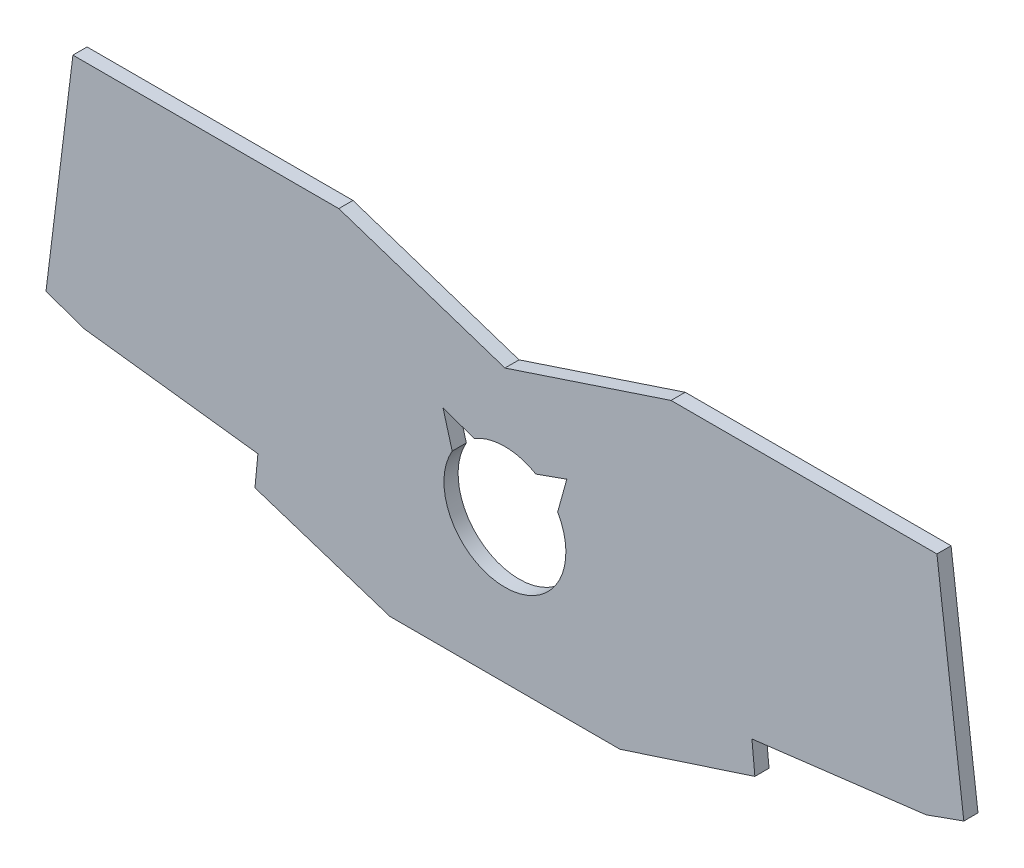
ISO-10303-21;
HEADER;
FILE_DESCRIPTION(('STEP AP214'),'2;1');
FILE_NAME('part.step','',(''),(''),'','','');
FILE_SCHEMA(('AUTOMOTIVE_DESIGN { 1 0 10303 214 1 1 1 1 }'));
ENDSEC;
DATA;
#1=APPLICATION_CONTEXT('core data for automotive mechanical design processes');
#2=APPLICATION_PROTOCOL_DEFINITION('international standard','automotive_design',2000,#1);
#3=PRODUCT_CONTEXT('',#1,'mechanical');
#4=PRODUCT('Part','Part','',(#3));
#5=PRODUCT_RELATED_PRODUCT_CATEGORY('part','',(#4));
#6=PRODUCT_DEFINITION_FORMATION('','',#4);
#7=PRODUCT_DEFINITION_CONTEXT('part definition',#1,'design');
#8=PRODUCT_DEFINITION('design','',#6,#7);
#9=PRODUCT_DEFINITION_SHAPE('','',#8);
#10=(LENGTH_UNIT() NAMED_UNIT(*) SI_UNIT(.MILLI.,.METRE.));
#11=(NAMED_UNIT(*) PLANE_ANGLE_UNIT() SI_UNIT($,.RADIAN.));
#12=(NAMED_UNIT(*) SI_UNIT($,.STERADIAN.) SOLID_ANGLE_UNIT());
#13=UNCERTAINTY_MEASURE_WITH_UNIT(LENGTH_MEASURE(1.E-05),#10,'distance_accuracy_value','');
#14=(GEOMETRIC_REPRESENTATION_CONTEXT(3) GLOBAL_UNCERTAINTY_ASSIGNED_CONTEXT((#13)) GLOBAL_UNIT_ASSIGNED_CONTEXT((#10,
#11,#12)) REPRESENTATION_CONTEXT('',''));
#15=CARTESIAN_POINT('',(0.,0.,0.));
#16=DIRECTION('',(0.,0.,1.));
#17=DIRECTION('',(1.,0.,0.));
#18=AXIS2_PLACEMENT_3D('',#15,#16,#17);
#19=CARTESIAN_POINT('',(24.215888920646,-67.992523684936,5.));
#20=DIRECTION('',(-0.33551108493973,0.942036258263218,0.));
#21=DIRECTION('',(-0.942036258263219,-0.33551108493973,0.));
#22=AXIS2_PLACEMENT_3D('',#19,#20,#21);
#23=PLANE('',#22);
#24=DIRECTION('',(0.942036258263219,0.33551108493973,0.));
#25=VECTOR('',#24,1.);
#26=CARTESIAN_POINT('',(24.215888920646,-67.992523684936,0.));
#27=LINE('',#26,#25);
#28=CARTESIAN_POINT('',(148.658722082,-23.6715651223478,0.));
#29=VERTEX_POINT('',#28);
#30=CARTESIAN_POINT('',(162.,-18.92,0.));
#31=VERTEX_POINT('',#30);
#32=EDGE_CURVE('E228',#29,#31,#27,.T.);
#33=ORIENTED_EDGE('',*,*,#32,.T.);
#34=DIRECTION('',(0.,0.,-1.));
#35=VECTOR('',#34,1.);
#36=CARTESIAN_POINT('',(162.,-18.92,5.));
#37=LINE('',#36,#35);
#38=CARTESIAN_POINT('',(162.,-18.92,5.));
#39=VERTEX_POINT('',#38);
#40=EDGE_CURVE('E11',#39,#31,#37,.T.);
#41=ORIENTED_EDGE('',*,*,#40,.F.);
#42=DIRECTION('',(0.942036258263219,0.33551108493973,0.));
#43=VECTOR('',#42,1.);
#44=CARTESIAN_POINT('',(24.215888920646,-67.992523684936,5.));
#45=LINE('',#44,#43);
#46=CARTESIAN_POINT('',(148.658722082,-23.6715651223478,5.));
#47=VERTEX_POINT('',#46);
#48=EDGE_CURVE('E577',#47,#39,#45,.T.);
#49=ORIENTED_EDGE('',*,*,#48,.F.);
#50=DIRECTION('',(0.,0.,-1.));
#51=VECTOR('',#50,1.);
#52=CARTESIAN_POINT('',(148.658722082,-23.6715651223478,5.));
#53=LINE('',#52,#51);
#54=EDGE_CURVE('E257',#47,#29,#53,.T.);
#55=ORIENTED_EDGE('',*,*,#54,.T.);
#56=EDGE_LOOP('',(#33,#41,#49,#55));
#57=FACE_BOUND('',#56,.T.);
#58=ADVANCED_FACE('F35',(#57),#23,.F.);
#59=CARTESIAN_POINT('',(157.264457802483,19.4229374561049,5.));
#60=DIRECTION('',(-0.992459421045995,-0.122573641444838,0.));
#61=DIRECTION('',(0.122573641444838,-0.992459421045995,0.));
#62=AXIS2_PLACEMENT_3D('',#59,#60,#61);
#63=PLANE('',#62);
#64=DIRECTION('',(-0.122573641444838,0.992459421045995,0.));
#65=VECTOR('',#64,1.);
#66=CARTESIAN_POINT('',(157.264457802483,19.4229374561049,0.));
#67=LINE('',#66,#65);
#68=CARTESIAN_POINT('',(152.5,58.,0.));
#69=VERTEX_POINT('',#68);
#70=EDGE_CURVE('E231',#31,#69,#67,.T.);
#71=ORIENTED_EDGE('',*,*,#70,.T.);
#72=DIRECTION('',(0.,0.,-1.));
#73=VECTOR('',#72,1.);
#74=CARTESIAN_POINT('',(152.5,58.,5.));
#75=LINE('',#74,#73);
#76=CARTESIAN_POINT('',(152.5,58.,5.));
#77=VERTEX_POINT('',#76);
#78=EDGE_CURVE('E45',#77,#69,#75,.T.);
#79=ORIENTED_EDGE('',*,*,#78,.F.);
#80=DIRECTION('',(-0.122573641444838,0.992459421045995,0.));
#81=VECTOR('',#80,1.);
#82=CARTESIAN_POINT('',(157.264457802483,19.4229374561049,5.));
#83=LINE('',#82,#81);
#84=EDGE_CURVE('E578',#39,#77,#83,.T.);
#85=ORIENTED_EDGE('',*,*,#84,.F.);
#86=ORIENTED_EDGE('',*,*,#40,.T.);
#87=EDGE_LOOP('',(#71,#79,#85,#86));
#88=FACE_BOUND('',#87,.T.);
#89=ADVANCED_FACE('F338',(#88),#63,.F.);
#90=CARTESIAN_POINT('',(0.,58.,5.));
#91=DIRECTION('',(0.,-1.,0.));
#92=DIRECTION('',(0.,0.,-1.));
#93=AXIS2_PLACEMENT_3D('',#90,#91,#92);
#94=PLANE('',#93);
#95=DIRECTION('',(-1.,0.,0.));
#96=VECTOR('',#95,1.);
#97=CARTESIAN_POINT('',(0.,58.,0.));
#98=LINE('',#97,#96);
#99=CARTESIAN_POINT('',(58.64,58.,0.));
#100=VERTEX_POINT('',#99);
#101=EDGE_CURVE('E233',#69,#100,#98,.T.);
#102=ORIENTED_EDGE('',*,*,#101,.T.);
#103=DIRECTION('',(0.,0.,-1.));
#104=VECTOR('',#103,1.);
#105=CARTESIAN_POINT('',(58.64,58.,5.));
#106=LINE('',#105,#104);
#107=CARTESIAN_POINT('',(58.64,58.,5.));
#108=VERTEX_POINT('',#107);
#109=EDGE_CURVE('E285',#108,#100,#106,.T.);
#110=ORIENTED_EDGE('',*,*,#109,.F.);
#111=DIRECTION('',(-1.,0.,0.));
#112=VECTOR('',#111,1.);
#113=CARTESIAN_POINT('',(0.,58.,5.));
#114=LINE('',#113,#112);
#115=EDGE_CURVE('E580',#77,#108,#114,.T.);
#116=ORIENTED_EDGE('',*,*,#115,.F.);
#117=ORIENTED_EDGE('',*,*,#78,.T.);
#118=EDGE_LOOP('',(#102,#110,#116,#117));
#119=FACE_BOUND('',#118,.T.);
#120=ADVANCED_FACE('F344',(#119),#94,.F.);
#121=CARTESIAN_POINT('',(-11.512097576617,34.7794642912324,5.));
#122=DIRECTION('',(0.314235776220578,-0.949344972569535,0.));
#123=DIRECTION('',(0.949344972569535,0.314235776220578,0.));
#124=AXIS2_PLACEMENT_3D('',#121,#122,#123);
#125=PLANE('',#124);
#126=DIRECTION('',(-0.949344972569535,-0.314235776220578,0.));
#127=VECTOR('',#126,1.);
#128=CARTESIAN_POINT('',(-11.512097576617,34.7794642912324,0.));
#129=LINE('',#128,#127);
#130=CARTESIAN_POINT('',(0.,38.59,0.));
#131=VERTEX_POINT('',#130);
#132=EDGE_CURVE('E235',#100,#131,#129,.T.);
#133=ORIENTED_EDGE('',*,*,#132,.T.);
#134=DIRECTION('',(0.,0.,-1.));
#135=VECTOR('',#134,1.);
#136=CARTESIAN_POINT('',(0.,38.59,5.));
#137=LINE('',#136,#135);
#138=CARTESIAN_POINT('',(0.,38.59,5.));
#139=VERTEX_POINT('',#138);
#140=EDGE_CURVE('E282',#139,#131,#137,.T.);
#141=ORIENTED_EDGE('',*,*,#140,.F.);
#142=DIRECTION('',(-0.949344972569535,-0.314235776220578,0.));
#143=VECTOR('',#142,1.);
#144=CARTESIAN_POINT('',(-11.512097576617,34.7794642912324,5.));
#145=LINE('',#144,#143);
#146=EDGE_CURVE('E544',#108,#139,#145,.T.);
#147=ORIENTED_EDGE('',*,*,#146,.F.);
#148=ORIENTED_EDGE('',*,*,#109,.T.);
#149=EDGE_LOOP('',(#133,#141,#147,#148));
#150=FACE_BOUND('',#149,.T.);
#151=ADVANCED_FACE('F495',(#150),#125,.F.);
#152=CARTESIAN_POINT('',(11.512097576617,34.7794642912324,5.));
#153=DIRECTION('',(-0.314235776220578,-0.949344972569535,0.));
#154=DIRECTION('',(0.949344972569535,-0.314235776220578,0.));
#155=AXIS2_PLACEMENT_3D('',#152,#153,#154);
#156=PLANE('',#155);
#157=DIRECTION('',(-0.949344972569535,0.314235776220578,0.));
#158=VECTOR('',#157,1.);
#159=CARTESIAN_POINT('',(11.512097576617,34.7794642912324,0.));
#160=LINE('',#159,#158);
#161=CARTESIAN_POINT('',(-58.64,58.,0.));
#162=VERTEX_POINT('',#161);
#163=EDGE_CURVE('E237',#131,#162,#160,.T.);
#164=ORIENTED_EDGE('',*,*,#163,.T.);
#165=DIRECTION('',(0.,0.,-1.));
#166=VECTOR('',#165,1.);
#167=CARTESIAN_POINT('',(-58.64,58.,5.));
#168=LINE('',#167,#166);
#169=CARTESIAN_POINT('',(-58.64,58.,5.));
#170=VERTEX_POINT('',#169);
#171=EDGE_CURVE('E279',#170,#162,#168,.T.);
#172=ORIENTED_EDGE('',*,*,#171,.F.);
#173=DIRECTION('',(-0.949344972569535,0.314235776220578,0.));
#174=VECTOR('',#173,1.);
#175=CARTESIAN_POINT('',(11.512097576617,34.7794642912324,5.));
#176=LINE('',#175,#174);
#177=EDGE_CURVE('E556',#139,#170,#176,.T.);
#178=ORIENTED_EDGE('',*,*,#177,.F.);
#179=ORIENTED_EDGE('',*,*,#140,.T.);
#180=EDGE_LOOP('',(#164,#172,#178,#179));
#181=FACE_BOUND('',#180,.T.);
#182=ADVANCED_FACE('F486',(#181),#156,.F.);
#183=CARTESIAN_POINT('',(0.,58.,5.));
#184=DIRECTION('',(0.,-1.,0.));
#185=DIRECTION('',(0.,0.,-1.));
#186=AXIS2_PLACEMENT_3D('',#183,#184,#185);
#187=PLANE('',#186);
#188=DIRECTION('',(-1.,0.,0.));
#189=VECTOR('',#188,1.);
#190=CARTESIAN_POINT('',(0.,58.,0.));
#191=LINE('',#190,#189);
#192=CARTESIAN_POINT('',(-152.5,58.,0.));
#193=VERTEX_POINT('',#192);
#194=EDGE_CURVE('E239',#162,#193,#191,.T.);
#195=ORIENTED_EDGE('',*,*,#194,.T.);
#196=DIRECTION('',(0.,0.,-1.));
#197=VECTOR('',#196,1.);
#198=CARTESIAN_POINT('',(-152.5,58.,5.));
#199=LINE('',#198,#197);
#200=CARTESIAN_POINT('',(-152.5,58.,5.));
#201=VERTEX_POINT('',#200);
#202=EDGE_CURVE('E276',#201,#193,#199,.T.);
#203=ORIENTED_EDGE('',*,*,#202,.F.);
#204=DIRECTION('',(-1.,0.,0.));
#205=VECTOR('',#204,1.);
#206=CARTESIAN_POINT('',(0.,58.,5.));
#207=LINE('',#206,#205);
#208=EDGE_CURVE('E553',#170,#201,#207,.T.);
#209=ORIENTED_EDGE('',*,*,#208,.F.);
#210=ORIENTED_EDGE('',*,*,#171,.T.);
#211=EDGE_LOOP('',(#195,#203,#209,#210));
#212=FACE_BOUND('',#211,.T.);
#213=ADVANCED_FACE('F477',(#212),#187,.F.);
#214=CARTESIAN_POINT('',(-157.264457802483,19.4229374561049,5.));
#215=DIRECTION('',(0.992459421045995,-0.122573641444838,0.));
#216=DIRECTION('',(0.122573641444838,0.992459421045995,0.));
#217=AXIS2_PLACEMENT_3D('',#214,#215,#216);
#218=PLANE('',#217);
#219=DIRECTION('',(-0.122573641444838,-0.992459421045995,0.));
#220=VECTOR('',#219,1.);
#221=CARTESIAN_POINT('',(-157.264457802483,19.4229374561049,0.));
#222=LINE('',#221,#220);
#223=CARTESIAN_POINT('',(-162.,-18.92,0.));
#224=VERTEX_POINT('',#223);
#225=EDGE_CURVE('E241',#193,#224,#222,.T.);
#226=ORIENTED_EDGE('',*,*,#225,.T.);
#227=DIRECTION('',(0.,0.,-1.));
#228=VECTOR('',#227,1.);
#229=CARTESIAN_POINT('',(-162.,-18.92,5.));
#230=LINE('',#229,#228);
#231=CARTESIAN_POINT('',(-162.,-18.92,5.));
#232=VERTEX_POINT('',#231);
#233=EDGE_CURVE('E273',#232,#224,#230,.T.);
#234=ORIENTED_EDGE('',*,*,#233,.F.);
#235=DIRECTION('',(-0.122573641444838,-0.992459421045995,0.));
#236=VECTOR('',#235,1.);
#237=CARTESIAN_POINT('',(-157.264457802483,19.4229374561049,5.));
#238=LINE('',#237,#236);
#239=EDGE_CURVE('E555',#201,#232,#238,.T.);
#240=ORIENTED_EDGE('',*,*,#239,.F.);
#241=ORIENTED_EDGE('',*,*,#202,.T.);
#242=EDGE_LOOP('',(#226,#234,#240,#241));
#243=FACE_BOUND('',#242,.T.);
#244=ADVANCED_FACE('F468',(#243),#218,.F.);
#245=CARTESIAN_POINT('',(-24.215888920646,-67.992523684936,5.));
#246=DIRECTION('',(0.33551108493973,0.942036258263218,0.));
#247=DIRECTION('',(-0.942036258263219,0.33551108493973,0.));
#248=AXIS2_PLACEMENT_3D('',#245,#246,#247);
#249=PLANE('',#248);
#250=DIRECTION('',(0.942036258263219,-0.33551108493973,0.));
#251=VECTOR('',#250,1.);
#252=CARTESIAN_POINT('',(-24.215888920646,-67.992523684936,0.));
#253=LINE('',#252,#251);
#254=CARTESIAN_POINT('',(-148.658722082,-23.6715651223478,0.));
#255=VERTEX_POINT('',#254);
#256=EDGE_CURVE('E243',#224,#255,#253,.T.);
#257=ORIENTED_EDGE('',*,*,#256,.T.);
#258=DIRECTION('',(0.,0.,-1.));
#259=VECTOR('',#258,1.);
#260=CARTESIAN_POINT('',(-148.658722082,-23.6715651223478,5.));
#261=LINE('',#260,#259);
#262=CARTESIAN_POINT('',(-148.658722082,-23.6715651223478,5.));
#263=VERTEX_POINT('',#262);
#264=EDGE_CURVE('E270',#263,#255,#261,.T.);
#265=ORIENTED_EDGE('',*,*,#264,.F.);
#266=DIRECTION('',(0.942036258263219,-0.33551108493973,0.));
#267=VECTOR('',#266,1.);
#268=CARTESIAN_POINT('',(-24.215888920646,-67.992523684936,5.));
#269=LINE('',#268,#267);
#270=EDGE_CURVE('E558',#232,#263,#269,.T.);
#271=ORIENTED_EDGE('',*,*,#270,.F.);
#272=ORIENTED_EDGE('',*,*,#233,.T.);
#273=EDGE_LOOP('',(#257,#265,#271,#272));
#274=FACE_BOUND('',#273,.T.);
#275=ADVANCED_FACE('F459',(#274),#249,.F.);
#276=CARTESIAN_POINT('',(-5.06858811236077,-41.2956704585539,5.));
#277=DIRECTION('',(0.121824765334384,0.992551624124016,0.));
#278=DIRECTION('',(-0.992551624124016,0.121824765334384,0.));
#279=AXIS2_PLACEMENT_3D('',#276,#277,#278);
#280=PLANE('',#279);
#281=DIRECTION('',(0.992551624124016,-0.121824765334384,0.));
#282=VECTOR('',#281,1.);
#283=CARTESIAN_POINT('',(-5.06858811236077,-41.2956704585539,0.));
#284=LINE('',#283,#282);
#285=CARTESIAN_POINT('',(-87.19,-31.2161728395062,0.));
#286=VERTEX_POINT('',#285);
#287=EDGE_CURVE('E245',#255,#286,#284,.T.);
#288=ORIENTED_EDGE('',*,*,#287,.T.);
#289=DIRECTION('',(0.,0.,-1.));
#290=VECTOR('',#289,1.);
#291=CARTESIAN_POINT('',(-87.19,-31.2161728395062,5.));
#292=LINE('',#291,#290);
#293=CARTESIAN_POINT('',(-87.19,-31.2161728395062,5.));
#294=VERTEX_POINT('',#293);
#295=EDGE_CURVE('E267',#294,#286,#292,.T.);
#296=ORIENTED_EDGE('',*,*,#295,.F.);
#297=DIRECTION('',(0.992551624124016,-0.121824765334384,0.));
#298=VECTOR('',#297,1.);
#299=CARTESIAN_POINT('',(-5.06858811236077,-41.2956704585539,5.));
#300=LINE('',#299,#298);
#301=EDGE_CURVE('E564',#263,#294,#300,.T.);
#302=ORIENTED_EDGE('',*,*,#301,.F.);
#303=ORIENTED_EDGE('',*,*,#264,.T.);
#304=EDGE_LOOP('',(#288,#296,#302,#303));
#305=FACE_BOUND('',#304,.T.);
#306=ADVANCED_FACE('F450',(#305),#280,.F.);
#307=CARTESIAN_POINT('',(-83.4376686731731,7.98636503999126,5.));
#308=DIRECTION('',(0.995450409463148,-0.0952810699963572,0.));
#309=DIRECTION('',(0.0952810699963573,0.995450409463148,0.));
#310=AXIS2_PLACEMENT_3D('',#307,#308,#309);
#311=PLANE('',#310);
#312=DIRECTION('',(-0.0952810699963573,-0.995450409463148,0.));
#313=VECTOR('',#312,1.);
#314=CARTESIAN_POINT('',(-83.4376686731731,7.98636503999126,0.));
#315=LINE('',#314,#313);
#316=CARTESIAN_POINT('',(-88.23713895926,-42.1561728395062,0.));
#317=VERTEX_POINT('',#316);
#318=EDGE_CURVE('E247',#286,#317,#315,.T.);
#319=ORIENTED_EDGE('',*,*,#318,.T.);
#320=DIRECTION('',(0.,0.,-1.));
#321=VECTOR('',#320,1.);
#322=CARTESIAN_POINT('',(-88.23713895926,-42.1561728395062,5.));
#323=LINE('',#322,#321);
#324=CARTESIAN_POINT('',(-88.23713895926,-42.1561728395062,5.));
#325=VERTEX_POINT('',#324);
#326=EDGE_CURVE('E264',#325,#317,#323,.T.);
#327=ORIENTED_EDGE('',*,*,#326,.F.);
#328=DIRECTION('',(-0.0952810699963573,-0.995450409463148,0.));
#329=VECTOR('',#328,1.);
#330=CARTESIAN_POINT('',(-83.4376686731731,7.98636503999126,5.));
#331=LINE('',#330,#329);
#332=EDGE_CURVE('E566',#294,#325,#331,.T.);
#333=ORIENTED_EDGE('',*,*,#332,.F.);
#334=ORIENTED_EDGE('',*,*,#295,.T.);
#335=EDGE_LOOP('',(#319,#327,#333,#334));
#336=FACE_BOUND('',#335,.T.);
#337=ADVANCED_FACE('F441',(#336),#311,.F.);
#338=CARTESIAN_POINT('',(-20.8593060042675,-64.0866967510715,5.));
#339=DIRECTION('',(0.309503806768121,0.950898203592815,0.));
#340=DIRECTION('',(-0.950898203592815,0.309503806768121,0.));
#341=AXIS2_PLACEMENT_3D('',#338,#339,#340);
#342=PLANE('',#341);
#343=DIRECTION('',(0.950898203592815,-0.309503806768121,0.));
#344=VECTOR('',#343,1.);
#345=CARTESIAN_POINT('',(-20.8593060042675,-64.0866967510715,0.));
#346=LINE('',#345,#344);
#347=CARTESIAN_POINT('',(-40.59713895926,-57.662313558589,0.));
#348=VERTEX_POINT('',#347);
#349=EDGE_CURVE('E249',#317,#348,#346,.T.);
#350=ORIENTED_EDGE('',*,*,#349,.T.);
#351=DIRECTION('',(0.,0.,-1.));
#352=VECTOR('',#351,1.);
#353=CARTESIAN_POINT('',(-40.59713895926,-57.662313558589,5.));
#354=LINE('',#353,#352);
#355=CARTESIAN_POINT('',(-40.59713895926,-57.662313558589,5.));
#356=VERTEX_POINT('',#355);
#357=EDGE_CURVE('E261',#356,#348,#354,.T.);
#358=ORIENTED_EDGE('',*,*,#357,.F.);
#359=DIRECTION('',(0.950898203592815,-0.309503806768121,0.));
#360=VECTOR('',#359,1.);
#361=CARTESIAN_POINT('',(-20.8593060042675,-64.0866967510715,5.));
#362=LINE('',#361,#360);
#363=EDGE_CURVE('E568',#325,#356,#362,.T.);
#364=ORIENTED_EDGE('',*,*,#363,.F.);
#365=ORIENTED_EDGE('',*,*,#326,.T.);
#366=EDGE_LOOP('',(#350,#358,#364,#365));
#367=FACE_BOUND('',#366,.T.);
#368=ADVANCED_FACE('F432',(#367),#342,.F.);
#369=CARTESIAN_POINT('',(0.,-57.662313558589,5.));
#370=DIRECTION('',(0.,1.,0.));
#371=DIRECTION('',(0.,0.,1.));
#372=AXIS2_PLACEMENT_3D('',#369,#370,#371);
#373=PLANE('',#372);
#374=DIRECTION('',(1.,0.,0.));
#375=VECTOR('',#374,1.);
#376=CARTESIAN_POINT('',(0.,-57.662313558589,0.));
#377=LINE('',#376,#375);
#378=CARTESIAN_POINT('',(40.59713895926,-57.662313558589,0.));
#379=VERTEX_POINT('',#378);
#380=EDGE_CURVE('E251',#348,#379,#377,.T.);
#381=ORIENTED_EDGE('',*,*,#380,.T.);
#382=DIRECTION('',(0.,0.,-1.));
#383=VECTOR('',#382,1.);
#384=CARTESIAN_POINT('',(40.59713895926,-57.662313558589,5.));
#385=LINE('',#384,#383);
#386=CARTESIAN_POINT('',(40.59713895926,-57.662313558589,5.));
#387=VERTEX_POINT('',#386);
#388=EDGE_CURVE('E204',#387,#379,#385,.T.);
#389=ORIENTED_EDGE('',*,*,#388,.F.);
#390=DIRECTION('',(1.,0.,0.));
#391=VECTOR('',#390,1.);
#392=CARTESIAN_POINT('',(0.,-57.662313558589,5.));
#393=LINE('',#392,#391);
#394=EDGE_CURVE('E195',#356,#387,#393,.T.);
#395=ORIENTED_EDGE('',*,*,#394,.F.);
#396=ORIENTED_EDGE('',*,*,#357,.T.);
#397=EDGE_LOOP('',(#381,#389,#395,#396));
#398=FACE_BOUND('',#397,.T.);
#399=ADVANCED_FACE('F424',(#398),#373,.F.);
#400=CARTESIAN_POINT('',(20.8593060042675,-64.0866967510715,5.));
#401=DIRECTION('',(-0.309503806768121,0.950898203592815,0.));
#402=DIRECTION('',(-0.950898203592815,-0.309503806768121,0.));
#403=AXIS2_PLACEMENT_3D('',#400,#401,#402);
#404=PLANE('',#403);
#405=DIRECTION('',(0.950898203592815,0.309503806768121,0.));
#406=VECTOR('',#405,1.);
#407=CARTESIAN_POINT('',(20.8593060042675,-64.0866967510715,0.));
#408=LINE('',#407,#406);
#409=CARTESIAN_POINT('',(88.23713895926,-42.1561728395062,0.));
#410=VERTEX_POINT('',#409);
#411=EDGE_CURVE('E203',#379,#410,#408,.T.);
#412=ORIENTED_EDGE('',*,*,#411,.T.);
#413=DIRECTION('',(0.,0.,-1.));
#414=VECTOR('',#413,1.);
#415=CARTESIAN_POINT('',(88.23713895926,-42.1561728395062,5.));
#416=LINE('',#415,#414);
#417=CARTESIAN_POINT('',(88.23713895926,-42.1561728395062,5.));
#418=VERTEX_POINT('',#417);
#419=EDGE_CURVE('E200',#418,#410,#416,.T.);
#420=ORIENTED_EDGE('',*,*,#419,.F.);
#421=DIRECTION('',(0.950898203592815,0.309503806768121,0.));
#422=VECTOR('',#421,1.);
#423=CARTESIAN_POINT('',(20.8593060042675,-64.0866967510715,5.));
#424=LINE('',#423,#422);
#425=EDGE_CURVE('E189',#387,#418,#424,.T.);
#426=ORIENTED_EDGE('',*,*,#425,.F.);
#427=ORIENTED_EDGE('',*,*,#388,.T.);
#428=EDGE_LOOP('',(#412,#420,#426,#427));
#429=FACE_BOUND('',#428,.T.);
#430=ADVANCED_FACE('F201',(#429),#404,.F.);
#431=CARTESIAN_POINT('',(83.4376686731731,7.98636503999126,5.));
#432=DIRECTION('',(-0.995450409463148,-0.0952810699963572,0.));
#433=DIRECTION('',(0.0952810699963573,-0.995450409463148,0.));
#434=AXIS2_PLACEMENT_3D('',#431,#432,#433);
#435=PLANE('',#434);
#436=DIRECTION('',(-0.0952810699963573,0.995450409463148,0.));
#437=VECTOR('',#436,1.);
#438=CARTESIAN_POINT('',(83.4376686731731,7.98636503999126,0.));
#439=LINE('',#438,#437);
#440=CARTESIAN_POINT('',(87.19,-31.2161728395062,0.));
#441=VERTEX_POINT('',#440);
#442=EDGE_CURVE('E122',#410,#441,#439,.T.);
#443=ORIENTED_EDGE('',*,*,#442,.T.);
#444=DIRECTION('',(0.,0.,-1.));
#445=VECTOR('',#444,1.);
#446=CARTESIAN_POINT('',(87.19,-31.2161728395062,5.));
#447=LINE('',#446,#445);
#448=CARTESIAN_POINT('',(87.19,-31.2161728395062,5.));
#449=VERTEX_POINT('',#448);
#450=EDGE_CURVE('E205',#449,#441,#447,.T.);
#451=ORIENTED_EDGE('',*,*,#450,.F.);
#452=DIRECTION('',(-0.0952810699963573,0.995450409463148,0.));
#453=VECTOR('',#452,1.);
#454=CARTESIAN_POINT('',(83.4376686731731,7.98636503999126,5.));
#455=LINE('',#454,#453);
#456=EDGE_CURVE('E193',#418,#449,#455,.T.);
#457=ORIENTED_EDGE('',*,*,#456,.F.);
#458=ORIENTED_EDGE('',*,*,#419,.T.);
#459=EDGE_LOOP('',(#443,#451,#457,#458));
#460=FACE_BOUND('',#459,.T.);
#461=ADVANCED_FACE('F207',(#460),#435,.F.);
#462=CARTESIAN_POINT('',(0.,-6.92999999999999,5.));
#463=DIRECTION('',(0.,0.,-1.));
#464=DIRECTION('',(-1.,0.,0.));
#465=AXIS2_PLACEMENT_3D('',#462,#463,#464);
#466=CYLINDRICAL_SURFACE('',#465,21.525);
#467=CARTESIAN_POINT('',(0.,-6.92999999999999,0.));
#468=DIRECTION('',(0.,0.,1.));
#469=DIRECTION('',(1.,0.,0.));
#470=AXIS2_PLACEMENT_3D('',#467,#468,#469);
#471=CIRCLE('',#470,21.525);
#472=CARTESIAN_POINT('',(10.9081951411467,11.6263170850971,0.));
#473=VERTEX_POINT('',#472);
#474=CARTESIAN_POINT('',(-10.9081951411467,11.6263170850971,0.));
#475=VERTEX_POINT('',#474);
#476=EDGE_CURVE('E213',#473,#475,#471,.T.);
#477=ORIENTED_EDGE('',*,*,#476,.F.);
#478=DIRECTION('',(0.,0.,-1.));
#479=VECTOR('',#478,1.);
#480=CARTESIAN_POINT('',(10.9081951411467,11.6263170850971,5.));
#481=LINE('',#480,#479);
#482=CARTESIAN_POINT('',(10.9081951411467,11.6263170850971,5.));
#483=VERTEX_POINT('',#482);
#484=EDGE_CURVE('E39',#483,#473,#481,.T.);
#485=ORIENTED_EDGE('',*,*,#484,.F.);
#486=CARTESIAN_POINT('',(0.,-6.92999999999999,5.));
#487=DIRECTION('',(0.,0.,1.));
#488=DIRECTION('',(1.,0.,0.));
#489=AXIS2_PLACEMENT_3D('',#486,#487,#488);
#490=CIRCLE('',#489,21.525);
#491=CARTESIAN_POINT('',(-10.9081951411467,11.6263170850971,5.));
#492=VERTEX_POINT('',#491);
#493=EDGE_CURVE('E256',#483,#492,#490,.T.);
#494=ORIENTED_EDGE('',*,*,#493,.T.);
#495=DIRECTION('',(0.,0.,-1.));
#496=VECTOR('',#495,1.);
#497=CARTESIAN_POINT('',(-10.9081951411467,11.6263170850971,5.));
#498=LINE('',#497,#496);
#499=EDGE_CURVE('E209',#492,#475,#498,.T.);
#500=ORIENTED_EDGE('',*,*,#499,.T.);
#501=EDGE_LOOP('',(#477,#485,#494,#500));
#502=FACE_BOUND('',#501,.T.);
#503=ADVANCED_FACE('F311',(#502),#466,.F.);
#504=CARTESIAN_POINT('',(-2.44512907259829,6.8819012571185,5.));
#505=DIRECTION('',(-0.334794607866043,0.94229112833764,0.));
#506=DIRECTION('',(-0.94229112833764,-0.334794607866043,0.));
#507=AXIS2_PLACEMENT_3D('',#504,#505,#506);
#508=PLANE('',#507);
#509=DIRECTION('',(0.94229112833764,0.334794607866043,0.));
#510=VECTOR('',#509,1.);
#511=CARTESIAN_POINT('',(-2.44512907259829,6.8819012571185,0.));
#512=LINE('',#511,#510);
#513=CARTESIAN_POINT('',(21.8481951411467,15.5132824824218,0.));
#514=VERTEX_POINT('',#513);
#515=EDGE_CURVE('E216',#473,#514,#512,.T.);
#516=ORIENTED_EDGE('',*,*,#515,.T.);
#517=DIRECTION('',(0.,0.,-1.));
#518=VECTOR('',#517,1.);
#519=CARTESIAN_POINT('',(21.8481951411467,15.5132824824218,5.));
#520=LINE('',#519,#518);
#521=CARTESIAN_POINT('',(21.8481951411467,15.5132824824218,5.));
#522=VERTEX_POINT('',#521);
#523=EDGE_CURVE('E296',#522,#514,#520,.T.);
#524=ORIENTED_EDGE('',*,*,#523,.F.);
#525=DIRECTION('',(0.94229112833764,0.334794607866043,0.));
#526=VECTOR('',#525,1.);
#527=CARTESIAN_POINT('',(-2.44512907259829,6.8819012571185,5.));
#528=LINE('',#527,#526);
#529=EDGE_CURVE('E304',#483,#522,#528,.T.);
#530=ORIENTED_EDGE('',*,*,#529,.F.);
#531=ORIENTED_EDGE('',*,*,#484,.T.);
#532=EDGE_LOOP('',(#516,#524,#530,#531));
#533=FACE_BOUND('',#532,.T.);
#534=ADVANCED_FACE('F37',(#533),#508,.F.);
#535=CARTESIAN_POINT('',(16.2879248086953,-4.52060390726765,5.));
#536=DIRECTION('',(0.963576158940397,-0.267434077712005,0.));
#537=DIRECTION('',(0.267434077712005,0.963576158940397,0.));
#538=AXIS2_PLACEMENT_3D('',#535,#536,#537);
#539=PLANE('',#538);
#540=DIRECTION('',(-0.267434077712005,-0.963576158940397,0.));
#541=VECTOR('',#540,1.);
#542=CARTESIAN_POINT('',(16.2879248086953,-4.52060390726765,0.));
#543=LINE('',#542,#541);
#544=CARTESIAN_POINT('',(18.6175914823856,3.87328248242181,0.));
#545=VERTEX_POINT('',#544);
#546=EDGE_CURVE('E219',#514,#545,#543,.T.);
#547=ORIENTED_EDGE('',*,*,#546,.T.);
#548=DIRECTION('',(0.,0.,-1.));
#549=VECTOR('',#548,1.);
#550=CARTESIAN_POINT('',(18.6175914823856,3.87328248242181,5.));
#551=LINE('',#550,#549);
#552=CARTESIAN_POINT('',(18.6175914823856,3.87328248242181,5.));
#553=VERTEX_POINT('',#552);
#554=EDGE_CURVE('E295',#553,#545,#551,.T.);
#555=ORIENTED_EDGE('',*,*,#554,.F.);
#556=DIRECTION('',(-0.267434077712005,-0.963576158940397,0.));
#557=VECTOR('',#556,1.);
#558=CARTESIAN_POINT('',(16.2879248086953,-4.52060390726765,5.));
#559=LINE('',#558,#557);
#560=EDGE_CURVE('E586',#522,#553,#559,.T.);
#561=ORIENTED_EDGE('',*,*,#560,.F.);
#562=ORIENTED_EDGE('',*,*,#523,.T.);
#563=EDGE_LOOP('',(#547,#555,#561,#562));
#564=FACE_BOUND('',#563,.T.);
#565=ADVANCED_FACE('F330',(#564),#539,.F.);
#566=CARTESIAN_POINT('',(-18.6175914823856,3.87328248242181,0.));
#567=VERTEX_POINT('',#566);
#568=EDGE_CURVE('E217',#567,#545,#471,.T.);
#569=ORIENTED_EDGE('',*,*,#568,.F.);
#570=DIRECTION('',(0.,0.,-1.));
#571=VECTOR('',#570,1.);
#572=CARTESIAN_POINT('',(-18.6175914823856,3.87328248242181,5.));
#573=LINE('',#572,#571);
#574=CARTESIAN_POINT('',(-18.6175914823856,3.87328248242181,5.));
#575=VERTEX_POINT('',#574);
#576=EDGE_CURVE('E293',#575,#567,#573,.T.);
#577=ORIENTED_EDGE('',*,*,#576,.F.);
#578=EDGE_CURVE('E329',#575,#553,#490,.T.);
#579=ORIENTED_EDGE('',*,*,#578,.T.);
#580=ORIENTED_EDGE('',*,*,#554,.T.);
#581=EDGE_LOOP('',(#569,#577,#579,#580));
#582=FACE_BOUND('',#581,.T.);
#583=ADVANCED_FACE('F327',(#582),#466,.F.);
#584=CARTESIAN_POINT('',(-16.2879248086953,-4.52060390726765,5.));
#585=DIRECTION('',(0.963576158940397,0.267434077712005,0.));
#586=DIRECTION('',(-0.267434077712005,0.963576158940397,0.));
#587=AXIS2_PLACEMENT_3D('',#584,#585,#586);
#588=PLANE('',#587);
#589=DIRECTION('',(0.267434077712005,-0.963576158940397,0.));
#590=VECTOR('',#589,1.);
#591=CARTESIAN_POINT('',(-16.2879248086953,-4.52060390726765,0.));
#592=LINE('',#591,#590);
#593=CARTESIAN_POINT('',(-21.8481951411467,15.5132824824218,0.));
#594=VERTEX_POINT('',#593);
#595=EDGE_CURVE('E222',#594,#567,#592,.T.);
#596=ORIENTED_EDGE('',*,*,#595,.F.);
#597=DIRECTION('',(0.,0.,-1.));
#598=VECTOR('',#597,1.);
#599=CARTESIAN_POINT('',(-21.8481951411467,15.5132824824218,5.));
#600=LINE('',#599,#598);
#601=CARTESIAN_POINT('',(-21.8481951411467,15.5132824824218,5.));
#602=VERTEX_POINT('',#601);
#603=EDGE_CURVE('E291',#602,#594,#600,.T.);
#604=ORIENTED_EDGE('',*,*,#603,.F.);
#605=DIRECTION('',(0.267434077712005,-0.963576158940397,0.));
#606=VECTOR('',#605,1.);
#607=CARTESIAN_POINT('',(-16.2879248086953,-4.52060390726765,5.));
#608=LINE('',#607,#606);
#609=EDGE_CURVE('E323',#602,#575,#608,.T.);
#610=ORIENTED_EDGE('',*,*,#609,.T.);
#611=ORIENTED_EDGE('',*,*,#576,.T.);
#612=EDGE_LOOP('',(#596,#604,#610,#611));
#613=FACE_BOUND('',#612,.T.);
#614=ADVANCED_FACE('F320',(#613),#588,.T.);
#615=CARTESIAN_POINT('',(2.44512907259829,6.8819012571185,5.));
#616=DIRECTION('',(-0.334794607866043,-0.94229112833764,0.));
#617=DIRECTION('',(0.94229112833764,-0.334794607866043,0.));
#618=AXIS2_PLACEMENT_3D('',#615,#616,#617);
#619=PLANE('',#618);
#620=DIRECTION('',(-0.94229112833764,0.334794607866043,0.));
#621=VECTOR('',#620,1.);
#622=CARTESIAN_POINT('',(2.44512907259829,6.8819012571185,0.));
#623=LINE('',#622,#621);
#624=EDGE_CURVE('E225',#475,#594,#623,.T.);
#625=ORIENTED_EDGE('',*,*,#624,.F.);
#626=ORIENTED_EDGE('',*,*,#499,.F.);
#627=DIRECTION('',(-0.94229112833764,0.334794607866043,0.));
#628=VECTOR('',#627,1.);
#629=CARTESIAN_POINT('',(2.44512907259829,6.8819012571185,5.));
#630=LINE('',#629,#628);
#631=EDGE_CURVE('E316',#492,#602,#630,.T.);
#632=ORIENTED_EDGE('',*,*,#631,.T.);
#633=ORIENTED_EDGE('',*,*,#603,.T.);
#634=EDGE_LOOP('',(#625,#626,#632,#633));
#635=FACE_BOUND('',#634,.T.);
#636=ADVANCED_FACE('F315',(#635),#619,.T.);
#637=CARTESIAN_POINT('',(5.06858811236077,-41.2956704585538,5.));
#638=DIRECTION('',(-0.121824765334384,0.992551624124016,0.));
#639=DIRECTION('',(-0.992551624124016,-0.121824765334384,0.));
#640=AXIS2_PLACEMENT_3D('',#637,#638,#639);
#641=PLANE('',#640);
#642=DIRECTION('',(0.992551624124016,0.121824765334384,0.));
#643=VECTOR('',#642,1.);
#644=CARTESIAN_POINT('',(5.06858811236077,-41.2956704585538,0.));
#645=LINE('',#644,#643);
#646=EDGE_CURVE('E128',#441,#29,#645,.T.);
#647=ORIENTED_EDGE('',*,*,#646,.T.);
#648=ORIENTED_EDGE('',*,*,#54,.F.);
#649=DIRECTION('',(0.992551624124016,0.121824765334384,0.));
#650=VECTOR('',#649,1.);
#651=CARTESIAN_POINT('',(5.06858811236077,-41.2956704585538,5.));
#652=LINE('',#651,#650);
#653=EDGE_CURVE('E54',#449,#47,#652,.T.);
#654=ORIENTED_EDGE('',*,*,#653,.F.);
#655=ORIENTED_EDGE('',*,*,#450,.T.);
#656=EDGE_LOOP('',(#647,#648,#654,#655));
#657=FACE_BOUND('',#656,.T.);
#658=ADVANCED_FACE('F351',(#657),#641,.F.);
#659=CARTESIAN_POINT('',(0.,0.,5.));
#660=DIRECTION('',(0.,0.,1.));
#661=DIRECTION('',(1.,0.,0.));
#662=AXIS2_PLACEMENT_3D('',#659,#660,#661);
#663=PLANE('',#662);
#664=ORIENTED_EDGE('',*,*,#493,.F.);
#665=ORIENTED_EDGE('',*,*,#529,.T.);
#666=ORIENTED_EDGE('',*,*,#560,.T.);
#667=ORIENTED_EDGE('',*,*,#578,.F.);
#668=ORIENTED_EDGE('',*,*,#609,.F.);
#669=ORIENTED_EDGE('',*,*,#631,.F.);
#670=EDGE_LOOP('',(#664,#665,#666,#667,#668,#669));
#671=FACE_BOUND('',#670,.T.);
#672=ORIENTED_EDGE('',*,*,#48,.T.);
#673=ORIENTED_EDGE('',*,*,#84,.T.);
#674=ORIENTED_EDGE('',*,*,#115,.T.);
#675=ORIENTED_EDGE('',*,*,#146,.T.);
#676=ORIENTED_EDGE('',*,*,#177,.T.);
#677=ORIENTED_EDGE('',*,*,#208,.T.);
#678=ORIENTED_EDGE('',*,*,#239,.T.);
#679=ORIENTED_EDGE('',*,*,#270,.T.);
#680=ORIENTED_EDGE('',*,*,#301,.T.);
#681=ORIENTED_EDGE('',*,*,#332,.T.);
#682=ORIENTED_EDGE('',*,*,#363,.T.);
#683=ORIENTED_EDGE('',*,*,#394,.T.);
#684=ORIENTED_EDGE('',*,*,#425,.T.);
#685=ORIENTED_EDGE('',*,*,#456,.T.);
#686=ORIENTED_EDGE('',*,*,#653,.T.);
#687=EDGE_LOOP('',(#672,#673,#674,#675,#676,#677,#678,#679,#680,#681,#682,#683,#684,#685,#686));
#688=FACE_BOUND('',#687,.T.);
#689=ADVANCED_FACE('F191',(#671,#688),#663,.T.);
#690=CARTESIAN_POINT('',(0.,0.,0.));
#691=DIRECTION('',(0.,0.,1.));
#692=DIRECTION('',(1.,0.,0.));
#693=AXIS2_PLACEMENT_3D('',#690,#691,#692);
#694=PLANE('',#693);
#695=ORIENTED_EDGE('',*,*,#476,.T.);
#696=ORIENTED_EDGE('',*,*,#624,.T.);
#697=ORIENTED_EDGE('',*,*,#595,.T.);
#698=ORIENTED_EDGE('',*,*,#568,.T.);
#699=ORIENTED_EDGE('',*,*,#546,.F.);
#700=ORIENTED_EDGE('',*,*,#515,.F.);
#701=EDGE_LOOP('',(#695,#696,#697,#698,#699,#700));
#702=FACE_BOUND('',#701,.T.);
#703=ORIENTED_EDGE('',*,*,#32,.F.);
#704=ORIENTED_EDGE('',*,*,#646,.F.);
#705=ORIENTED_EDGE('',*,*,#442,.F.);
#706=ORIENTED_EDGE('',*,*,#411,.F.);
#707=ORIENTED_EDGE('',*,*,#380,.F.);
#708=ORIENTED_EDGE('',*,*,#349,.F.);
#709=ORIENTED_EDGE('',*,*,#318,.F.);
#710=ORIENTED_EDGE('',*,*,#287,.F.);
#711=ORIENTED_EDGE('',*,*,#256,.F.);
#712=ORIENTED_EDGE('',*,*,#225,.F.);
#713=ORIENTED_EDGE('',*,*,#194,.F.);
#714=ORIENTED_EDGE('',*,*,#163,.F.);
#715=ORIENTED_EDGE('',*,*,#132,.F.);
#716=ORIENTED_EDGE('',*,*,#101,.F.);
#717=ORIENTED_EDGE('',*,*,#70,.F.);
#718=EDGE_LOOP('',(#703,#704,#705,#706,#707,#708,#709,#710,#711,#712,#713,#714,#715,#716,#717));
#719=FACE_BOUND('',#718,.T.);
#720=ADVANCED_FACE('F307',(#702,#719),#694,.F.);
#721=CLOSED_SHELL('',(#58,#89,#120,#151,#182,#213,#244,#275,#306,#337,#368,#399,#430,#461,#503,
#534,#565,#583,#614,#636,#658,#689,#720));
#722=MANIFOLD_SOLID_BREP('B2',#721);
#723=ADVANCED_BREP_SHAPE_REPRESENTATION('',(#18,#722),#14);
#724=SHAPE_DEFINITION_REPRESENTATION(#9,#723);
ENDSEC;
END-ISO-10303-21;
